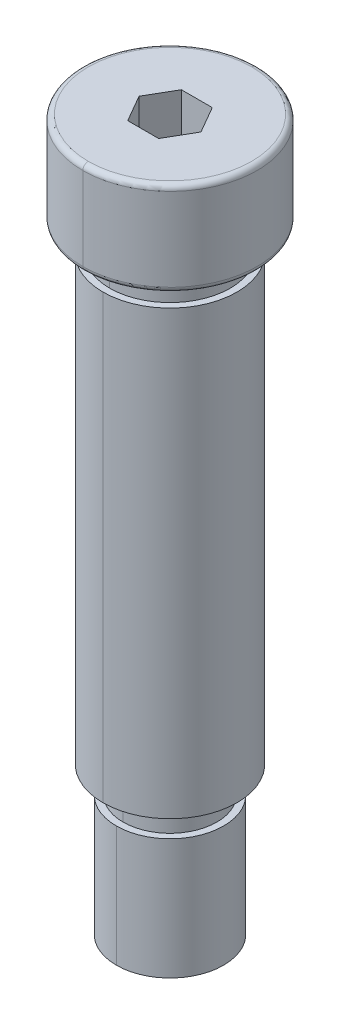
ISO-10303-21;
HEADER;
FILE_DESCRIPTION(('STEP AP214'),'2;1');
FILE_NAME('part.step','',(''),(''),'','','');
FILE_SCHEMA(('AUTOMOTIVE_DESIGN { 1 0 10303 214 1 1 1 1 }'));
ENDSEC;
DATA;
#1=APPLICATION_CONTEXT('core data for automotive mechanical design processes');
#2=APPLICATION_PROTOCOL_DEFINITION('international standard','automotive_design',2000,#1);
#3=PRODUCT_CONTEXT('',#1,'mechanical');
#4=PRODUCT('Part','Part','',(#3));
#5=PRODUCT_RELATED_PRODUCT_CATEGORY('part','',(#4));
#6=PRODUCT_DEFINITION_FORMATION('','',#4);
#7=PRODUCT_DEFINITION_CONTEXT('part definition',#1,'design');
#8=PRODUCT_DEFINITION('design','',#6,#7);
#9=PRODUCT_DEFINITION_SHAPE('','',#8);
#10=(LENGTH_UNIT() NAMED_UNIT(*) SI_UNIT(.MILLI.,.METRE.));
#11=(NAMED_UNIT(*) PLANE_ANGLE_UNIT() SI_UNIT($,.RADIAN.));
#12=(NAMED_UNIT(*) SI_UNIT($,.STERADIAN.) SOLID_ANGLE_UNIT());
#13=UNCERTAINTY_MEASURE_WITH_UNIT(LENGTH_MEASURE(1.E-05),#10,'distance_accuracy_value','');
#14=(GEOMETRIC_REPRESENTATION_CONTEXT(3) GLOBAL_UNCERTAINTY_ASSIGNED_CONTEXT((#13)) GLOBAL_UNIT_ASSIGNED_CONTEXT((#10,
#11,#12)) REPRESENTATION_CONTEXT('',''));
#15=CARTESIAN_POINT('',(0.,0.,0.));
#16=DIRECTION('',(0.,0.,1.));
#17=DIRECTION('',(1.,0.,0.));
#18=AXIS2_PLACEMENT_3D('',#15,#16,#17);
#19=CARTESIAN_POINT('',(0.,0.,0.));
#20=DIRECTION('',(0.,-1.,0.));
#21=DIRECTION('',(0.,0.,-1.));
#22=AXIS2_PLACEMENT_3D('',#19,#20,#21);
#23=CYLINDRICAL_SURFACE('',#22,4.);
#24=CARTESIAN_POINT('',(0.,9.,0.));
#25=DIRECTION('',(0.,-1.,0.));
#26=DIRECTION('',(0.,0.,-1.));
#27=AXIS2_PLACEMENT_3D('',#24,#25,#26);
#28=CIRCLE('',#27,4.);
#29=CARTESIAN_POINT('',(0.,9.,-4.));
#30=VERTEX_POINT('',#29);
#31=CARTESIAN_POINT('',(0.,9.,4.));
#32=VERTEX_POINT('',#31);
#33=EDGE_CURVE('E11',#30,#32,#28,.T.);
#34=ORIENTED_EDGE('',*,*,#33,.T.);
#35=DIRECTION('',(0.,-1.,0.));
#36=VECTOR('',#35,1.);
#37=CARTESIAN_POINT('',(0.,0.,4.));
#38=LINE('',#37,#36);
#39=CARTESIAN_POINT('',(0.,0.,4.));
#40=VERTEX_POINT('',#39);
#41=EDGE_CURVE('E28',#32,#40,#38,.T.);
#42=ORIENTED_EDGE('',*,*,#41,.T.);
#43=CARTESIAN_POINT('',(0.,0.,0.));
#44=DIRECTION('',(0.,-1.,0.));
#45=DIRECTION('',(0.,0.,-1.));
#46=AXIS2_PLACEMENT_3D('',#43,#44,#45);
#47=CIRCLE('',#46,4.);
#48=CARTESIAN_POINT('',(0.,0.,-4.));
#49=VERTEX_POINT('',#48);
#50=EDGE_CURVE('E304',#49,#40,#47,.T.);
#51=ORIENTED_EDGE('',*,*,#50,.F.);
#52=DIRECTION('',(0.,-1.,0.));
#53=VECTOR('',#52,1.);
#54=CARTESIAN_POINT('',(0.,0.,-4.));
#55=LINE('',#54,#53);
#56=EDGE_CURVE('E299',#30,#49,#55,.T.);
#57=ORIENTED_EDGE('',*,*,#56,.F.);
#58=EDGE_LOOP('',(#34,#42,#51,#57));
#59=FACE_BOUND('',#58,.T.);
#60=ADVANCED_FACE('F17',(#59),#23,.T.);
#61=CARTESIAN_POINT('',(0.,0.,0.));
#62=DIRECTION('',(0.,-1.,0.));
#63=DIRECTION('',(0.,0.,-1.));
#64=AXIS2_PLACEMENT_3D('',#61,#62,#63);
#65=CYLINDRICAL_SURFACE('',#64,3.5);
#66=CARTESIAN_POINT('',(0.,11.,0.));
#67=DIRECTION('',(0.,-1.,0.));
#68=DIRECTION('',(0.,0.,-1.));
#69=AXIS2_PLACEMENT_3D('',#66,#67,#68);
#70=CIRCLE('',#69,3.5);
#71=CARTESIAN_POINT('',(0.,11.,-3.5));
#72=VERTEX_POINT('',#71);
#73=CARTESIAN_POINT('',(0.,11.,3.5));
#74=VERTEX_POINT('',#73);
#75=EDGE_CURVE('E282',#72,#74,#70,.T.);
#76=ORIENTED_EDGE('',*,*,#75,.T.);
#77=DIRECTION('',(0.,-1.,0.));
#78=VECTOR('',#77,1.);
#79=CARTESIAN_POINT('',(0.,0.,3.5));
#80=LINE('',#79,#78);
#81=CARTESIAN_POINT('',(0.,9.,3.5));
#82=VERTEX_POINT('',#81);
#83=EDGE_CURVE('E286',#74,#82,#80,.T.);
#84=ORIENTED_EDGE('',*,*,#83,.T.);
#85=CARTESIAN_POINT('',(0.,9.,0.));
#86=DIRECTION('',(0.,-1.,0.));
#87=DIRECTION('',(0.,0.,-1.));
#88=AXIS2_PLACEMENT_3D('',#85,#86,#87);
#89=CIRCLE('',#88,3.5);
#90=CARTESIAN_POINT('',(0.,9.,-3.5));
#91=VERTEX_POINT('',#90);
#92=EDGE_CURVE('E337',#91,#82,#89,.T.);
#93=ORIENTED_EDGE('',*,*,#92,.F.);
#94=DIRECTION('',(0.,-1.,0.));
#95=VECTOR('',#94,1.);
#96=CARTESIAN_POINT('',(0.,0.,-3.5));
#97=LINE('',#96,#95);
#98=EDGE_CURVE('E298',#72,#91,#97,.T.);
#99=ORIENTED_EDGE('',*,*,#98,.F.);
#100=EDGE_LOOP('',(#76,#84,#93,#99));
#101=FACE_BOUND('',#100,.T.);
#102=ADVANCED_FACE('F604',(#101),#65,.T.);
#103=CARTESIAN_POINT('',(0.,0.,0.));
#104=DIRECTION('',(0.,-1.,0.));
#105=DIRECTION('',(0.,0.,-1.));
#106=AXIS2_PLACEMENT_3D('',#103,#104,#105);
#107=CYLINDRICAL_SURFACE('',#106,5.);
#108=CARTESIAN_POINT('',(0.,44.,0.));
#109=DIRECTION('',(0.,-1.,0.));
#110=DIRECTION('',(0.,0.,-1.));
#111=AXIS2_PLACEMENT_3D('',#108,#109,#110);
#112=CIRCLE('',#111,5.);
#113=CARTESIAN_POINT('',(0.,44.,-5.));
#114=VERTEX_POINT('',#113);
#115=CARTESIAN_POINT('',(0.,44.,5.));
#116=VERTEX_POINT('',#115);
#117=EDGE_CURVE('E263',#114,#116,#112,.T.);
#118=ORIENTED_EDGE('',*,*,#117,.T.);
#119=DIRECTION('',(0.,-1.,0.));
#120=VECTOR('',#119,1.);
#121=CARTESIAN_POINT('',(0.,0.,5.));
#122=LINE('',#121,#120);
#123=CARTESIAN_POINT('',(0.,11.,5.));
#124=VERTEX_POINT('',#123);
#125=EDGE_CURVE('E259',#116,#124,#122,.T.);
#126=ORIENTED_EDGE('',*,*,#125,.T.);
#127=CARTESIAN_POINT('',(0.,11.,0.));
#128=DIRECTION('',(0.,-1.,0.));
#129=DIRECTION('',(0.,0.,-1.));
#130=AXIS2_PLACEMENT_3D('',#127,#128,#129);
#131=CIRCLE('',#130,5.);
#132=CARTESIAN_POINT('',(0.,11.,-5.));
#133=VERTEX_POINT('',#132);
#134=EDGE_CURVE('E318',#133,#124,#131,.T.);
#135=ORIENTED_EDGE('',*,*,#134,.F.);
#136=DIRECTION('',(0.,-1.,0.));
#137=VECTOR('',#136,1.);
#138=CARTESIAN_POINT('',(0.,0.,-5.));
#139=LINE('',#138,#137);
#140=EDGE_CURVE('E321',#114,#133,#139,.T.);
#141=ORIENTED_EDGE('',*,*,#140,.F.);
#142=EDGE_LOOP('',(#118,#126,#135,#141));
#143=FACE_BOUND('',#142,.T.);
#144=ADVANCED_FACE('F599',(#143),#107,.T.);
#145=CARTESIAN_POINT('',(0.,0.,0.));
#146=DIRECTION('',(0.,-1.,0.));
#147=DIRECTION('',(0.,0.,-1.));
#148=AXIS2_PLACEMENT_3D('',#145,#146,#147);
#149=CYLINDRICAL_SURFACE('',#148,4.5);
#150=CARTESIAN_POINT('',(0.,46.,0.));
#151=DIRECTION('',(0.,-1.,0.));
#152=DIRECTION('',(0.,0.,-1.));
#153=AXIS2_PLACEMENT_3D('',#150,#151,#152);
#154=CIRCLE('',#153,4.5);
#155=CARTESIAN_POINT('',(0.,46.,-4.5));
#156=VERTEX_POINT('',#155);
#157=CARTESIAN_POINT('',(0.,46.,4.5));
#158=VERTEX_POINT('',#157);
#159=EDGE_CURVE('E264',#156,#158,#154,.T.);
#160=ORIENTED_EDGE('',*,*,#159,.T.);
#161=DIRECTION('',(0.,-1.,0.));
#162=VECTOR('',#161,1.);
#163=CARTESIAN_POINT('',(0.,0.,4.5));
#164=LINE('',#163,#162);
#165=CARTESIAN_POINT('',(0.,44.,4.5));
#166=VERTEX_POINT('',#165);
#167=EDGE_CURVE('E113',#158,#166,#164,.T.);
#168=ORIENTED_EDGE('',*,*,#167,.T.);
#169=CARTESIAN_POINT('',(0.,44.,0.));
#170=DIRECTION('',(0.,-1.,0.));
#171=DIRECTION('',(0.,0.,-1.));
#172=AXIS2_PLACEMENT_3D('',#169,#170,#171);
#173=CIRCLE('',#172,4.5);
#174=CARTESIAN_POINT('',(0.,44.,-4.5));
#175=VERTEX_POINT('',#174);
#176=EDGE_CURVE('E127',#175,#166,#173,.T.);
#177=ORIENTED_EDGE('',*,*,#176,.F.);
#178=DIRECTION('',(0.,-1.,0.));
#179=VECTOR('',#178,1.);
#180=CARTESIAN_POINT('',(0.,0.,-4.5));
#181=LINE('',#180,#179);
#182=EDGE_CURVE('E253',#156,#175,#181,.T.);
#183=ORIENTED_EDGE('',*,*,#182,.F.);
#184=EDGE_LOOP('',(#160,#168,#177,#183));
#185=FACE_BOUND('',#184,.T.);
#186=ADVANCED_FACE('F603',(#185),#149,.T.);
#187=CARTESIAN_POINT('',(0.,46.4,0.));
#188=DIRECTION('',(0.,-1.,0.));
#189=DIRECTION('',(0.,0.,-1.));
#190=AXIS2_PLACEMENT_3D('',#187,#188,#189);
#191=TOROIDAL_SURFACE('',#190,6.1,0.4);
#192=CARTESIAN_POINT('',(0.,46.4,0.));
#193=DIRECTION('',(0.,-1.,0.));
#194=DIRECTION('',(0.,0.,-1.));
#195=AXIS2_PLACEMENT_3D('',#192,#193,#194);
#196=CIRCLE('',#195,6.5);
#197=CARTESIAN_POINT('',(0.,46.4,-6.5));
#198=VERTEX_POINT('',#197);
#199=CARTESIAN_POINT('',(0.,46.4,6.5));
#200=VERTEX_POINT('',#199);
#201=EDGE_CURVE('E289',#198,#200,#196,.T.);
#202=ORIENTED_EDGE('',*,*,#201,.T.);
#203=CARTESIAN_POINT('',(0.,46.4,6.1));
#204=DIRECTION('',(1.,0.,0.));
#205=DIRECTION('',(0.,0.,-1.));
#206=AXIS2_PLACEMENT_3D('',#203,#204,#205);
#207=CIRCLE('',#206,0.4);
#208=CARTESIAN_POINT('',(0.,46.,6.1));
#209=VERTEX_POINT('',#208);
#210=EDGE_CURVE('E322',#200,#209,#207,.T.);
#211=ORIENTED_EDGE('',*,*,#210,.T.);
#212=CARTESIAN_POINT('',(0.,46.,0.));
#213=DIRECTION('',(0.,-1.,0.));
#214=DIRECTION('',(0.,0.,-1.));
#215=AXIS2_PLACEMENT_3D('',#212,#213,#214);
#216=CIRCLE('',#215,6.1);
#217=CARTESIAN_POINT('',(0.,46.,-6.1));
#218=VERTEX_POINT('',#217);
#219=EDGE_CURVE('E162',#218,#209,#216,.T.);
#220=ORIENTED_EDGE('',*,*,#219,.F.);
#221=CARTESIAN_POINT('',(0.,46.4,-6.1));
#222=DIRECTION('',(-1.,0.,0.));
#223=DIRECTION('',(0.,0.,1.));
#224=AXIS2_PLACEMENT_3D('',#221,#222,#223);
#225=CIRCLE('',#224,0.4);
#226=EDGE_CURVE('E170',#198,#218,#225,.T.);
#227=ORIENTED_EDGE('',*,*,#226,.F.);
#228=EDGE_LOOP('',(#202,#211,#220,#227));
#229=FACE_BOUND('',#228,.T.);
#230=ADVANCED_FACE('F655',(#229),#191,.T.);
#231=CARTESIAN_POINT('',(0.,0.,0.));
#232=DIRECTION('',(0.,-1.,0.));
#233=DIRECTION('',(0.,0.,-1.));
#234=AXIS2_PLACEMENT_3D('',#231,#232,#233);
#235=CYLINDRICAL_SURFACE('',#234,6.5);
#236=CARTESIAN_POINT('',(0.,52.6,0.));
#237=DIRECTION('',(0.,-1.,0.));
#238=DIRECTION('',(0.,0.,-1.));
#239=AXIS2_PLACEMENT_3D('',#236,#237,#238);
#240=CIRCLE('',#239,6.5);
#241=CARTESIAN_POINT('',(0.,52.6,-6.5));
#242=VERTEX_POINT('',#241);
#243=CARTESIAN_POINT('',(0.,52.6,6.5));
#244=VERTEX_POINT('',#243);
#245=EDGE_CURVE('E310',#242,#244,#240,.T.);
#246=ORIENTED_EDGE('',*,*,#245,.T.);
#247=DIRECTION('',(0.,-1.,0.));
#248=VECTOR('',#247,1.);
#249=CARTESIAN_POINT('',(0.,0.,6.5));
#250=LINE('',#249,#248);
#251=EDGE_CURVE('E308',#244,#200,#250,.T.);
#252=ORIENTED_EDGE('',*,*,#251,.T.);
#253=ORIENTED_EDGE('',*,*,#201,.F.);
#254=DIRECTION('',(0.,-1.,0.));
#255=VECTOR('',#254,1.);
#256=CARTESIAN_POINT('',(0.,0.,-6.5));
#257=LINE('',#256,#255);
#258=EDGE_CURVE('E277',#242,#198,#257,.T.);
#259=ORIENTED_EDGE('',*,*,#258,.F.);
#260=EDGE_LOOP('',(#246,#252,#253,#259));
#261=FACE_BOUND('',#260,.T.);
#262=ADVANCED_FACE('F659',(#261),#235,.T.);
#263=CARTESIAN_POINT('',(0.,52.6,0.));
#264=DIRECTION('',(0.,-1.,0.));
#265=DIRECTION('',(0.,0.,-1.));
#266=AXIS2_PLACEMENT_3D('',#263,#264,#265);
#267=TOROIDAL_SURFACE('',#266,6.1,0.4);
#268=CARTESIAN_POINT('',(0.,53.,0.));
#269=DIRECTION('',(0.,-1.,0.));
#270=DIRECTION('',(0.,0.,-1.));
#271=AXIS2_PLACEMENT_3D('',#268,#269,#270);
#272=CIRCLE('',#271,6.1);
#273=CARTESIAN_POINT('',(0.,53.,-6.1));
#274=VERTEX_POINT('',#273);
#275=CARTESIAN_POINT('',(0.,53.,6.1));
#276=VERTEX_POINT('',#275);
#277=EDGE_CURVE('E311',#274,#276,#272,.T.);
#278=ORIENTED_EDGE('',*,*,#277,.T.);
#279=CARTESIAN_POINT('',(0.,52.6,6.1));
#280=DIRECTION('',(1.,0.,0.));
#281=DIRECTION('',(0.,0.,-1.));
#282=AXIS2_PLACEMENT_3D('',#279,#280,#281);
#283=CIRCLE('',#282,0.4);
#284=EDGE_CURVE('E182',#276,#244,#283,.T.);
#285=ORIENTED_EDGE('',*,*,#284,.T.);
#286=ORIENTED_EDGE('',*,*,#245,.F.);
#287=CARTESIAN_POINT('',(0.,52.6,-6.1));
#288=DIRECTION('',(-1.,0.,0.));
#289=DIRECTION('',(0.,0.,1.));
#290=AXIS2_PLACEMENT_3D('',#287,#288,#289);
#291=CIRCLE('',#290,0.4);
#292=EDGE_CURVE('E276',#274,#242,#291,.T.);
#293=ORIENTED_EDGE('',*,*,#292,.F.);
#294=EDGE_LOOP('',(#278,#285,#286,#293));
#295=FACE_BOUND('',#294,.T.);
#296=ADVANCED_FACE('F19',(#295),#267,.T.);
#297=CARTESIAN_POINT('',(0.,53.,0.));
#298=DIRECTION('',(0.,-1.,0.));
#299=DIRECTION('',(0.,0.,-1.));
#300=AXIS2_PLACEMENT_3D('',#297,#298,#299);
#301=PLANE('',#300);
#302=ORIENTED_EDGE('',*,*,#277,.F.);
#303=CARTESIAN_POINT('',(0.,53.,0.));
#304=DIRECTION('',(0.,-1.,0.));
#305=DIRECTION('',(0.,0.,-1.));
#306=AXIS2_PLACEMENT_3D('',#303,#304,#305);
#307=CIRCLE('',#306,6.1);
#308=EDGE_CURVE('E327',#276,#274,#307,.T.);
#309=ORIENTED_EDGE('',*,*,#308,.F.);
#310=EDGE_LOOP('',(#302,#309));
#311=FACE_BOUND('',#310,.T.);
#312=DIRECTION('',(-1.,0.,0.));
#313=VECTOR('',#312,1.);
#314=CARTESIAN_POINT('',(1.15470053837925,53.,-2.));
#315=LINE('',#314,#313);
#316=CARTESIAN_POINT('',(1.15470053837925,53.,-2.));
#317=VERTEX_POINT('',#316);
#318=CARTESIAN_POINT('',(-1.15470053837925,53.,-2.));
#319=VERTEX_POINT('',#318);
#320=EDGE_CURVE('E236',#317,#319,#315,.T.);
#321=ORIENTED_EDGE('',*,*,#320,.F.);
#322=DIRECTION('',(-0.5,0.,-0.866025403784439));
#323=VECTOR('',#322,1.);
#324=CARTESIAN_POINT('',(2.30940107675851,53.,0.));
#325=LINE('',#324,#323);
#326=CARTESIAN_POINT('',(2.30940107675851,53.,0.));
#327=VERTEX_POINT('',#326);
#328=EDGE_CURVE('E233',#327,#317,#325,.T.);
#329=ORIENTED_EDGE('',*,*,#328,.F.);
#330=DIRECTION('',(0.5,0.,-0.866025403784439));
#331=VECTOR('',#330,1.);
#332=CARTESIAN_POINT('',(1.15470053837925,53.,2.));
#333=LINE('',#332,#331);
#334=CARTESIAN_POINT('',(1.15470053837925,53.,2.));
#335=VERTEX_POINT('',#334);
#336=EDGE_CURVE('E281',#335,#327,#333,.T.);
#337=ORIENTED_EDGE('',*,*,#336,.F.);
#338=DIRECTION('',(1.,0.,0.));
#339=VECTOR('',#338,1.);
#340=CARTESIAN_POINT('',(-1.15470053837925,53.,2.));
#341=LINE('',#340,#339);
#342=CARTESIAN_POINT('',(-1.15470053837925,53.,2.));
#343=VERTEX_POINT('',#342);
#344=EDGE_CURVE('E255',#343,#335,#341,.T.);
#345=ORIENTED_EDGE('',*,*,#344,.F.);
#346=DIRECTION('',(0.5,0.,0.866025403784439));
#347=VECTOR('',#346,1.);
#348=CARTESIAN_POINT('',(-2.30940107675851,53.,0.));
#349=LINE('',#348,#347);
#350=CARTESIAN_POINT('',(-2.30940107675851,53.,0.));
#351=VERTEX_POINT('',#350);
#352=EDGE_CURVE('E193',#351,#343,#349,.T.);
#353=ORIENTED_EDGE('',*,*,#352,.F.);
#354=DIRECTION('',(-0.5,0.,0.866025403784439));
#355=VECTOR('',#354,1.);
#356=CARTESIAN_POINT('',(-1.15470053837925,53.,-2.));
#357=LINE('',#356,#355);
#358=EDGE_CURVE('E206',#319,#351,#357,.T.);
#359=ORIENTED_EDGE('',*,*,#358,.F.);
#360=EDGE_LOOP('',(#321,#329,#337,#345,#353,#359));
#361=FACE_BOUND('',#360,.T.);
#362=ADVANCED_FACE('F589',(#311,#361),#301,.F.);
#363=CARTESIAN_POINT('',(0.,52.6,0.));
#364=DIRECTION('',(0.,-1.,0.));
#365=DIRECTION('',(0.,0.,-1.));
#366=AXIS2_PLACEMENT_3D('',#363,#364,#365);
#367=TOROIDAL_SURFACE('',#366,6.1,0.4);
#368=ORIENTED_EDGE('',*,*,#284,.F.);
#369=ORIENTED_EDGE('',*,*,#308,.T.);
#370=ORIENTED_EDGE('',*,*,#292,.T.);
#371=CARTESIAN_POINT('',(0.,52.6,0.));
#372=DIRECTION('',(0.,-1.,0.));
#373=DIRECTION('',(0.,0.,-1.));
#374=AXIS2_PLACEMENT_3D('',#371,#372,#373);
#375=CIRCLE('',#374,6.5);
#376=EDGE_CURVE('E272',#244,#242,#375,.T.);
#377=ORIENTED_EDGE('',*,*,#376,.F.);
#378=EDGE_LOOP('',(#368,#369,#370,#377));
#379=FACE_BOUND('',#378,.T.);
#380=ADVANCED_FACE('F593',(#379),#367,.T.);
#381=CARTESIAN_POINT('',(0.,0.,0.));
#382=DIRECTION('',(0.,-1.,0.));
#383=DIRECTION('',(0.,0.,-1.));
#384=AXIS2_PLACEMENT_3D('',#381,#382,#383);
#385=CYLINDRICAL_SURFACE('',#384,6.5);
#386=ORIENTED_EDGE('',*,*,#251,.F.);
#387=ORIENTED_EDGE('',*,*,#376,.T.);
#388=ORIENTED_EDGE('',*,*,#258,.T.);
#389=CARTESIAN_POINT('',(0.,46.4,0.));
#390=DIRECTION('',(0.,-1.,0.));
#391=DIRECTION('',(0.,0.,-1.));
#392=AXIS2_PLACEMENT_3D('',#389,#390,#391);
#393=CIRCLE('',#392,6.5);
#394=EDGE_CURVE('E333',#200,#198,#393,.T.);
#395=ORIENTED_EDGE('',*,*,#394,.F.);
#396=EDGE_LOOP('',(#386,#387,#388,#395));
#397=FACE_BOUND('',#396,.T.);
#398=ADVANCED_FACE('F676',(#397),#385,.T.);
#399=CARTESIAN_POINT('',(0.,46.4,0.));
#400=DIRECTION('',(0.,-1.,0.));
#401=DIRECTION('',(0.,0.,-1.));
#402=AXIS2_PLACEMENT_3D('',#399,#400,#401);
#403=TOROIDAL_SURFACE('',#402,6.1,0.4);
#404=ORIENTED_EDGE('',*,*,#210,.F.);
#405=ORIENTED_EDGE('',*,*,#394,.T.);
#406=ORIENTED_EDGE('',*,*,#226,.T.);
#407=CARTESIAN_POINT('',(0.,46.,0.));
#408=DIRECTION('',(0.,-1.,0.));
#409=DIRECTION('',(0.,0.,-1.));
#410=AXIS2_PLACEMENT_3D('',#407,#408,#409);
#411=CIRCLE('',#410,6.1);
#412=EDGE_CURVE('E265',#209,#218,#411,.T.);
#413=ORIENTED_EDGE('',*,*,#412,.F.);
#414=EDGE_LOOP('',(#404,#405,#406,#413));
#415=FACE_BOUND('',#414,.T.);
#416=ADVANCED_FACE('F615',(#415),#403,.T.);
#417=CARTESIAN_POINT('',(-6.1,46.,0.));
#418=DIRECTION('',(0.,1.,0.));
#419=DIRECTION('',(1.,0.,0.));
#420=AXIS2_PLACEMENT_3D('',#417,#418,#419);
#421=PLANE('',#420);
#422=ORIENTED_EDGE('',*,*,#219,.T.);
#423=ORIENTED_EDGE('',*,*,#412,.T.);
#424=EDGE_LOOP('',(#422,#423));
#425=FACE_BOUND('',#424,.T.);
#426=ORIENTED_EDGE('',*,*,#159,.F.);
#427=CARTESIAN_POINT('',(0.,46.,0.));
#428=DIRECTION('',(0.,-1.,0.));
#429=DIRECTION('',(0.,0.,-1.));
#430=AXIS2_PLACEMENT_3D('',#427,#428,#429);
#431=CIRCLE('',#430,4.5);
#432=EDGE_CURVE('E269',#158,#156,#431,.T.);
#433=ORIENTED_EDGE('',*,*,#432,.F.);
#434=EDGE_LOOP('',(#426,#433));
#435=FACE_BOUND('',#434,.T.);
#436=ADVANCED_FACE('F610',(#425,#435),#421,.F.);
#437=CARTESIAN_POINT('',(0.,0.,0.));
#438=DIRECTION('',(0.,-1.,0.));
#439=DIRECTION('',(0.,0.,-1.));
#440=AXIS2_PLACEMENT_3D('',#437,#438,#439);
#441=CYLINDRICAL_SURFACE('',#440,4.5);
#442=ORIENTED_EDGE('',*,*,#167,.F.);
#443=ORIENTED_EDGE('',*,*,#432,.T.);
#444=ORIENTED_EDGE('',*,*,#182,.T.);
#445=CARTESIAN_POINT('',(0.,44.,0.));
#446=DIRECTION('',(0.,-1.,0.));
#447=DIRECTION('',(0.,0.,-1.));
#448=AXIS2_PLACEMENT_3D('',#445,#446,#447);
#449=CIRCLE('',#448,4.5);
#450=EDGE_CURVE('E315',#166,#175,#449,.T.);
#451=ORIENTED_EDGE('',*,*,#450,.F.);
#452=EDGE_LOOP('',(#442,#443,#444,#451));
#453=FACE_BOUND('',#452,.T.);
#454=ADVANCED_FACE('F614',(#453),#441,.T.);
#455=CARTESIAN_POINT('',(-4.5,44.,0.));
#456=DIRECTION('',(0.,-1.,0.));
#457=DIRECTION('',(0.,0.,-1.));
#458=AXIS2_PLACEMENT_3D('',#455,#456,#457);
#459=PLANE('',#458);
#460=ORIENTED_EDGE('',*,*,#117,.F.);
#461=CARTESIAN_POINT('',(0.,44.,0.));
#462=DIRECTION('',(0.,-1.,0.));
#463=DIRECTION('',(0.,0.,-1.));
#464=AXIS2_PLACEMENT_3D('',#461,#462,#463);
#465=CIRCLE('',#464,5.);
#466=EDGE_CURVE('E21',#116,#114,#465,.T.);
#467=ORIENTED_EDGE('',*,*,#466,.F.);
#468=EDGE_LOOP('',(#460,#467));
#469=FACE_BOUND('',#468,.T.);
#470=ORIENTED_EDGE('',*,*,#176,.T.);
#471=ORIENTED_EDGE('',*,*,#450,.T.);
#472=EDGE_LOOP('',(#470,#471));
#473=FACE_BOUND('',#472,.T.);
#474=ADVANCED_FACE('F634',(#469,#473),#459,.F.);
#475=CARTESIAN_POINT('',(0.,0.,0.));
#476=DIRECTION('',(0.,-1.,0.));
#477=DIRECTION('',(0.,0.,-1.));
#478=AXIS2_PLACEMENT_3D('',#475,#476,#477);
#479=CYLINDRICAL_SURFACE('',#478,5.);
#480=ORIENTED_EDGE('',*,*,#125,.F.);
#481=ORIENTED_EDGE('',*,*,#466,.T.);
#482=ORIENTED_EDGE('',*,*,#140,.T.);
#483=CARTESIAN_POINT('',(0.,11.,0.));
#484=DIRECTION('',(0.,-1.,0.));
#485=DIRECTION('',(0.,0.,-1.));
#486=AXIS2_PLACEMENT_3D('',#483,#484,#485);
#487=CIRCLE('',#486,5.);
#488=EDGE_CURVE('E297',#124,#133,#487,.T.);
#489=ORIENTED_EDGE('',*,*,#488,.F.);
#490=EDGE_LOOP('',(#480,#481,#482,#489));
#491=FACE_BOUND('',#490,.T.);
#492=ADVANCED_FACE('F629',(#491),#479,.T.);
#493=CARTESIAN_POINT('',(-5.,11.,0.));
#494=DIRECTION('',(0.,1.,0.));
#495=DIRECTION('',(1.,0.,0.));
#496=AXIS2_PLACEMENT_3D('',#493,#494,#495);
#497=PLANE('',#496);
#498=ORIENTED_EDGE('',*,*,#134,.T.);
#499=ORIENTED_EDGE('',*,*,#488,.T.);
#500=EDGE_LOOP('',(#498,#499));
#501=FACE_BOUND('',#500,.T.);
#502=ORIENTED_EDGE('',*,*,#75,.F.);
#503=CARTESIAN_POINT('',(0.,11.,0.));
#504=DIRECTION('',(0.,-1.,0.));
#505=DIRECTION('',(0.,0.,-1.));
#506=AXIS2_PLACEMENT_3D('',#503,#504,#505);
#507=CIRCLE('',#506,3.5);
#508=EDGE_CURVE('E293',#74,#72,#507,.T.);
#509=ORIENTED_EDGE('',*,*,#508,.F.);
#510=EDGE_LOOP('',(#502,#509));
#511=FACE_BOUND('',#510,.T.);
#512=ADVANCED_FACE('F633',(#501,#511),#497,.F.);
#513=CARTESIAN_POINT('',(0.,0.,0.));
#514=DIRECTION('',(0.,-1.,0.));
#515=DIRECTION('',(0.,0.,-1.));
#516=AXIS2_PLACEMENT_3D('',#513,#514,#515);
#517=CYLINDRICAL_SURFACE('',#516,3.5);
#518=ORIENTED_EDGE('',*,*,#83,.F.);
#519=ORIENTED_EDGE('',*,*,#508,.T.);
#520=ORIENTED_EDGE('',*,*,#98,.T.);
#521=CARTESIAN_POINT('',(0.,9.,0.));
#522=DIRECTION('',(0.,-1.,0.));
#523=DIRECTION('',(0.,0.,-1.));
#524=AXIS2_PLACEMENT_3D('',#521,#522,#523);
#525=CIRCLE('',#524,3.5);
#526=EDGE_CURVE('E347',#82,#91,#525,.T.);
#527=ORIENTED_EDGE('',*,*,#526,.F.);
#528=EDGE_LOOP('',(#518,#519,#520,#527));
#529=FACE_BOUND('',#528,.T.);
#530=ADVANCED_FACE('F685',(#529),#517,.T.);
#531=CARTESIAN_POINT('',(-3.5,9.,0.));
#532=DIRECTION('',(0.,-1.,0.));
#533=DIRECTION('',(0.,0.,-1.));
#534=AXIS2_PLACEMENT_3D('',#531,#532,#533);
#535=PLANE('',#534);
#536=ORIENTED_EDGE('',*,*,#33,.F.);
#537=CARTESIAN_POINT('',(0.,9.,0.));
#538=DIRECTION('',(0.,-1.,0.));
#539=DIRECTION('',(0.,0.,-1.));
#540=AXIS2_PLACEMENT_3D('',#537,#538,#539);
#541=CIRCLE('',#540,4.);
#542=EDGE_CURVE('E303',#32,#30,#541,.T.);
#543=ORIENTED_EDGE('',*,*,#542,.F.);
#544=EDGE_LOOP('',(#536,#543));
#545=FACE_BOUND('',#544,.T.);
#546=ORIENTED_EDGE('',*,*,#92,.T.);
#547=ORIENTED_EDGE('',*,*,#526,.T.);
#548=EDGE_LOOP('',(#546,#547));
#549=FACE_BOUND('',#548,.T.);
#550=ADVANCED_FACE('F698',(#545,#549),#535,.F.);
#551=CARTESIAN_POINT('',(0.,0.,0.));
#552=DIRECTION('',(0.,-1.,0.));
#553=DIRECTION('',(0.,0.,-1.));
#554=AXIS2_PLACEMENT_3D('',#551,#552,#553);
#555=CYLINDRICAL_SURFACE('',#554,4.);
#556=ORIENTED_EDGE('',*,*,#41,.F.);
#557=ORIENTED_EDGE('',*,*,#542,.T.);
#558=ORIENTED_EDGE('',*,*,#56,.T.);
#559=CARTESIAN_POINT('',(0.,0.,0.));
#560=DIRECTION('',(0.,-1.,0.));
#561=DIRECTION('',(0.,0.,-1.));
#562=AXIS2_PLACEMENT_3D('',#559,#560,#561);
#563=CIRCLE('',#562,4.);
#564=EDGE_CURVE('E388',#40,#49,#563,.T.);
#565=ORIENTED_EDGE('',*,*,#564,.F.);
#566=EDGE_LOOP('',(#556,#557,#558,#565));
#567=FACE_BOUND('',#566,.T.);
#568=ADVANCED_FACE('F667',(#567),#555,.T.);
#569=CARTESIAN_POINT('',(-4.,0.,0.));
#570=DIRECTION('',(0.,1.,0.));
#571=DIRECTION('',(1.,0.,0.));
#572=AXIS2_PLACEMENT_3D('',#569,#570,#571);
#573=PLANE('',#572);
#574=ORIENTED_EDGE('',*,*,#50,.T.);
#575=ORIENTED_EDGE('',*,*,#564,.T.);
#576=EDGE_LOOP('',(#574,#575));
#577=FACE_BOUND('',#576,.T.);
#578=ADVANCED_FACE('F567',(#577),#573,.F.);
#579=CARTESIAN_POINT('',(2.30940107675851,49.5,0.));
#580=DIRECTION('',(0.866025403784439,0.,-0.5));
#581=DIRECTION('',(0.,-1.,0.));
#582=AXIS2_PLACEMENT_3D('',#579,#580,#581);
#583=PLANE('',#582);
#584=ORIENTED_EDGE('',*,*,#328,.T.);
#585=DIRECTION('',(0.,1.,0.));
#586=VECTOR('',#585,1.);
#587=CARTESIAN_POINT('',(1.15470053837925,49.5,-2.));
#588=LINE('',#587,#586);
#589=CARTESIAN_POINT('',(1.15470053837925,49.5,-2.));
#590=VERTEX_POINT('',#589);
#591=EDGE_CURVE('E227',#590,#317,#588,.T.);
#592=ORIENTED_EDGE('',*,*,#591,.F.);
#593=DIRECTION('',(-0.5,0.,-0.866025403784439));
#594=VECTOR('',#593,1.);
#595=CARTESIAN_POINT('',(2.30940107675851,49.5,0.));
#596=LINE('',#595,#594);
#597=CARTESIAN_POINT('',(2.30940107675851,49.5,0.));
#598=VERTEX_POINT('',#597);
#599=EDGE_CURVE('E214',#598,#590,#596,.T.);
#600=ORIENTED_EDGE('',*,*,#599,.F.);
#601=DIRECTION('',(0.,1.,0.));
#602=VECTOR('',#601,1.);
#603=CARTESIAN_POINT('',(2.30940107675851,49.5,0.));
#604=LINE('',#603,#602);
#605=EDGE_CURVE('E389',#598,#327,#604,.T.);
#606=ORIENTED_EDGE('',*,*,#605,.T.);
#607=EDGE_LOOP('',(#584,#592,#600,#606));
#608=FACE_BOUND('',#607,.T.);
#609=ADVANCED_FACE('F231',(#608),#583,.F.);
#610=CARTESIAN_POINT('',(1.15470053837925,49.5,2.));
#611=DIRECTION('',(0.866025403784439,0.,0.5));
#612=DIRECTION('',(0.,-1.,0.));
#613=AXIS2_PLACEMENT_3D('',#610,#611,#612);
#614=PLANE('',#613);
#615=ORIENTED_EDGE('',*,*,#336,.T.);
#616=ORIENTED_EDGE('',*,*,#605,.F.);
#617=DIRECTION('',(0.5,0.,-0.866025403784439));
#618=VECTOR('',#617,1.);
#619=CARTESIAN_POINT('',(1.15470053837925,49.5,2.));
#620=LINE('',#619,#618);
#621=CARTESIAN_POINT('',(1.15470053837925,49.5,2.));
#622=VERTEX_POINT('',#621);
#623=EDGE_CURVE('E222',#622,#598,#620,.T.);
#624=ORIENTED_EDGE('',*,*,#623,.F.);
#625=DIRECTION('',(0.,1.,0.));
#626=VECTOR('',#625,1.);
#627=CARTESIAN_POINT('',(1.15470053837925,49.5,2.));
#628=LINE('',#627,#626);
#629=EDGE_CURVE('E257',#622,#335,#628,.T.);
#630=ORIENTED_EDGE('',*,*,#629,.T.);
#631=EDGE_LOOP('',(#615,#616,#624,#630));
#632=FACE_BOUND('',#631,.T.);
#633=ADVANCED_FACE('F566',(#632),#614,.F.);
#634=CARTESIAN_POINT('',(-1.15470053837925,49.5,2.));
#635=DIRECTION('',(0.,0.,1.));
#636=DIRECTION('',(1.,0.,0.));
#637=AXIS2_PLACEMENT_3D('',#634,#635,#636);
#638=PLANE('',#637);
#639=ORIENTED_EDGE('',*,*,#344,.T.);
#640=ORIENTED_EDGE('',*,*,#629,.F.);
#641=DIRECTION('',(1.,0.,0.));
#642=VECTOR('',#641,1.);
#643=CARTESIAN_POINT('',(-1.15470053837925,49.5,2.));
#644=LINE('',#643,#642);
#645=CARTESIAN_POINT('',(-1.15470053837925,49.5,2.));
#646=VERTEX_POINT('',#645);
#647=EDGE_CURVE('E305',#646,#622,#644,.T.);
#648=ORIENTED_EDGE('',*,*,#647,.F.);
#649=DIRECTION('',(0.,1.,0.));
#650=VECTOR('',#649,1.);
#651=CARTESIAN_POINT('',(-1.15470053837925,49.5,2.));
#652=LINE('',#651,#650);
#653=EDGE_CURVE('E258',#646,#343,#652,.T.);
#654=ORIENTED_EDGE('',*,*,#653,.T.);
#655=EDGE_LOOP('',(#639,#640,#648,#654));
#656=FACE_BOUND('',#655,.T.);
#657=ADVANCED_FACE('F584',(#656),#638,.F.);
#658=CARTESIAN_POINT('',(-2.30940107675851,49.5,0.));
#659=DIRECTION('',(-0.866025403784439,0.,0.5));
#660=DIRECTION('',(0.,1.,0.));
#661=AXIS2_PLACEMENT_3D('',#658,#659,#660);
#662=PLANE('',#661);
#663=ORIENTED_EDGE('',*,*,#352,.T.);
#664=ORIENTED_EDGE('',*,*,#653,.F.);
#665=DIRECTION('',(0.5,0.,0.866025403784439));
#666=VECTOR('',#665,1.);
#667=CARTESIAN_POINT('',(-2.30940107675851,49.5,0.));
#668=LINE('',#667,#666);
#669=CARTESIAN_POINT('',(-2.30940107675851,49.5,0.));
#670=VERTEX_POINT('',#669);
#671=EDGE_CURVE('E249',#670,#646,#668,.T.);
#672=ORIENTED_EDGE('',*,*,#671,.F.);
#673=DIRECTION('',(0.,1.,0.));
#674=VECTOR('',#673,1.);
#675=CARTESIAN_POINT('',(-2.30940107675851,49.5,0.));
#676=LINE('',#675,#674);
#677=EDGE_CURVE('E375',#670,#351,#676,.T.);
#678=ORIENTED_EDGE('',*,*,#677,.T.);
#679=EDGE_LOOP('',(#663,#664,#672,#678));
#680=FACE_BOUND('',#679,.T.);
#681=ADVANCED_FACE('F579',(#680),#662,.F.);
#682=CARTESIAN_POINT('',(-1.15470053837925,49.5,-2.));
#683=DIRECTION('',(-0.866025403784439,0.,-0.5));
#684=DIRECTION('',(-0.5,0.,0.866025403784439));
#685=AXIS2_PLACEMENT_3D('',#682,#683,#684);
#686=PLANE('',#685);
#687=ORIENTED_EDGE('',*,*,#358,.T.);
#688=ORIENTED_EDGE('',*,*,#677,.F.);
#689=DIRECTION('',(-0.5,0.,0.866025403784439));
#690=VECTOR('',#689,1.);
#691=CARTESIAN_POINT('',(-1.15470053837925,49.5,-2.));
#692=LINE('',#691,#690);
#693=CARTESIAN_POINT('',(-1.15470053837925,49.5,-2.));
#694=VERTEX_POINT('',#693);
#695=EDGE_CURVE('E242',#694,#670,#692,.T.);
#696=ORIENTED_EDGE('',*,*,#695,.F.);
#697=DIRECTION('',(0.,1.,0.));
#698=VECTOR('',#697,1.);
#699=CARTESIAN_POINT('',(-1.15470053837925,49.5,-2.));
#700=LINE('',#699,#698);
#701=EDGE_CURVE('E240',#694,#319,#700,.T.);
#702=ORIENTED_EDGE('',*,*,#701,.T.);
#703=EDGE_LOOP('',(#687,#688,#696,#702));
#704=FACE_BOUND('',#703,.T.);
#705=ADVANCED_FACE('F583',(#704),#686,.F.);
#706=CARTESIAN_POINT('',(1.15470053837925,49.5,-2.));
#707=DIRECTION('',(0.,0.,-1.));
#708=DIRECTION('',(-1.,0.,0.));
#709=AXIS2_PLACEMENT_3D('',#706,#707,#708);
#710=PLANE('',#709);
#711=ORIENTED_EDGE('',*,*,#320,.T.);
#712=ORIENTED_EDGE('',*,*,#701,.F.);
#713=DIRECTION('',(-1.,0.,0.));
#714=VECTOR('',#713,1.);
#715=CARTESIAN_POINT('',(1.15470053837925,49.5,-2.));
#716=LINE('',#715,#714);
#717=EDGE_CURVE('E219',#590,#694,#716,.T.);
#718=ORIENTED_EDGE('',*,*,#717,.F.);
#719=ORIENTED_EDGE('',*,*,#591,.T.);
#720=EDGE_LOOP('',(#711,#712,#718,#719));
#721=FACE_BOUND('',#720,.T.);
#722=ADVANCED_FACE('F239',(#721),#710,.F.);
#723=CARTESIAN_POINT('',(0.,49.5,0.));
#724=DIRECTION('',(0.,1.,0.));
#725=DIRECTION('',(1.,0.,0.));
#726=AXIS2_PLACEMENT_3D('',#723,#724,#725);
#727=PLANE('',#726);
#728=ORIENTED_EDGE('',*,*,#599,.T.);
#729=ORIENTED_EDGE('',*,*,#717,.T.);
#730=ORIENTED_EDGE('',*,*,#695,.T.);
#731=ORIENTED_EDGE('',*,*,#671,.T.);
#732=ORIENTED_EDGE('',*,*,#647,.T.);
#733=ORIENTED_EDGE('',*,*,#623,.T.);
#734=EDGE_LOOP('',(#728,#729,#730,#731,#732,#733));
#735=FACE_BOUND('',#734,.T.);
#736=ADVANCED_FACE('F216',(#735),#727,.T.);
#737=CLOSED_SHELL('',(#60,#102,#144,#186,#230,#262,#296,#362,#380,#398,#416,#436,#454,#474,#492,
#512,#530,#550,#568,#578,#609,#633,#657,#681,#705,#722,#736));
#738=MANIFOLD_SOLID_BREP('B1',#737);
#739=ADVANCED_BREP_SHAPE_REPRESENTATION('',(#18,#738),#14);
#740=SHAPE_DEFINITION_REPRESENTATION(#9,#739);
ENDSEC;
END-ISO-10303-21;
